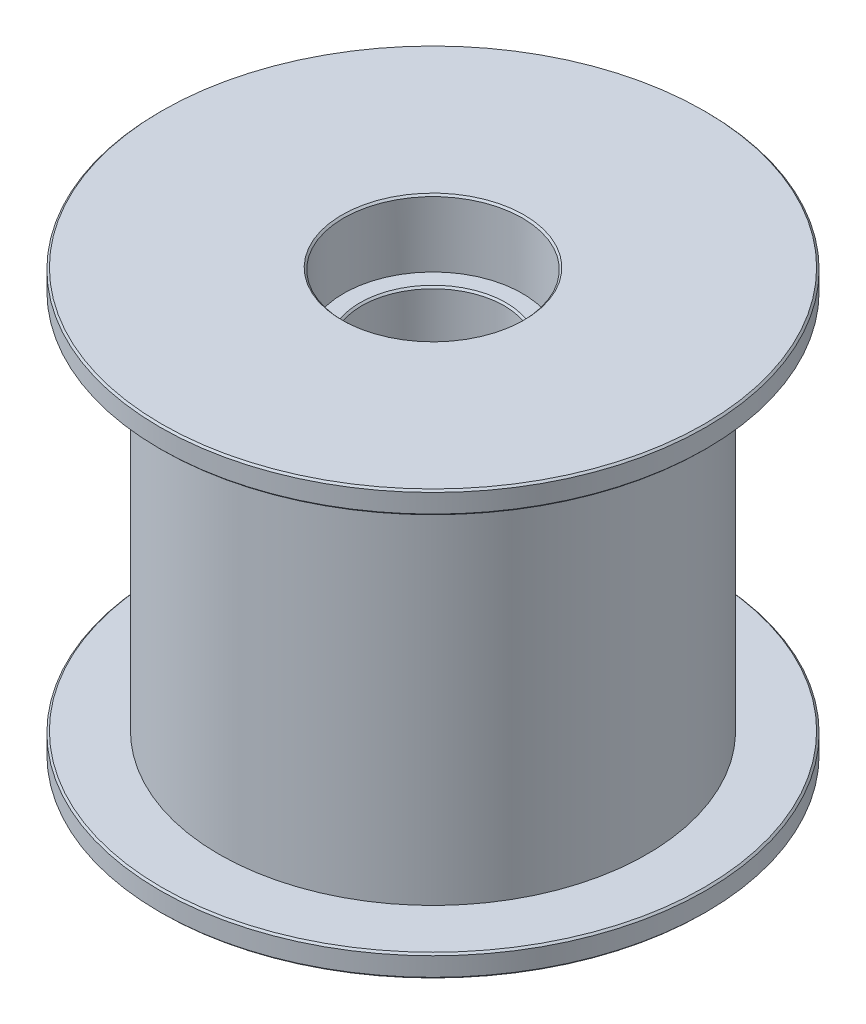
ISO-10303-21;
HEADER;
FILE_DESCRIPTION(('STEP AP214'),'2;1');
FILE_NAME('part.step','',(''),(''),'','','');
FILE_SCHEMA(('AUTOMOTIVE_DESIGN { 1 0 10303 214 1 1 1 1 }'));
ENDSEC;
DATA;
#1=APPLICATION_CONTEXT('core data for automotive mechanical design processes');
#2=APPLICATION_PROTOCOL_DEFINITION('international standard','automotive_design',2000,#1);
#3=PRODUCT_CONTEXT('',#1,'mechanical');
#4=PRODUCT('Part','Part','',(#3));
#5=PRODUCT_RELATED_PRODUCT_CATEGORY('part','',(#4));
#6=PRODUCT_DEFINITION_FORMATION('','',#4);
#7=PRODUCT_DEFINITION_CONTEXT('part definition',#1,'design');
#8=PRODUCT_DEFINITION('design','',#6,#7);
#9=PRODUCT_DEFINITION_SHAPE('','',#8);
#10=(LENGTH_UNIT() NAMED_UNIT(*) SI_UNIT(.MILLI.,.METRE.));
#11=(NAMED_UNIT(*) PLANE_ANGLE_UNIT() SI_UNIT($,.RADIAN.));
#12=(NAMED_UNIT(*) SI_UNIT($,.STERADIAN.) SOLID_ANGLE_UNIT());
#13=UNCERTAINTY_MEASURE_WITH_UNIT(LENGTH_MEASURE(1.E-05),#10,'distance_accuracy_value','');
#14=(GEOMETRIC_REPRESENTATION_CONTEXT(3) GLOBAL_UNCERTAINTY_ASSIGNED_CONTEXT((#13)) GLOBAL_UNIT_ASSIGNED_CONTEXT((#10,
#11,#12)) REPRESENTATION_CONTEXT('',''));
#15=CARTESIAN_POINT('',(0.,0.,0.));
#16=DIRECTION('',(0.,0.,1.));
#17=DIRECTION('',(1.,0.,0.));
#18=AXIS2_PLACEMENT_3D('',#15,#16,#17);
#19=CARTESIAN_POINT('',(0.,30.1625,0.));
#20=DIRECTION('',(0.,1.,0.));
#21=DIRECTION('',(0.,0.,1.));
#22=AXIS2_PLACEMENT_3D('',#19,#20,#21);
#23=CYLINDRICAL_SURFACE('',#22,19.446875);
#24=CARTESIAN_POINT('',(0.,1.4605,0.));
#25=DIRECTION('',(0.,-1.,0.));
#26=DIRECTION('',(0.,0.,-1.));
#27=AXIS2_PLACEMENT_3D('',#24,#25,#26);
#28=CIRCLE('',#27,19.446875);
#29=CARTESIAN_POINT('',(0.,1.4605,-19.446875));
#30=VERTEX_POINT('',#29);
#31=EDGE_CURVE('E94',#30,#30,#28,.T.);
#32=ORIENTED_EDGE('',*,*,#31,.T.);
#33=EDGE_LOOP('',(#32));
#34=FACE_BOUND('',#33,.T.);
#35=CARTESIAN_POINT('',(0.,0.126999999999995,0.));
#36=DIRECTION('',(0.,1.,0.));
#37=DIRECTION('',(0.,0.,1.));
#38=AXIS2_PLACEMENT_3D('',#35,#36,#37);
#39=CIRCLE('',#38,19.446875);
#40=CARTESIAN_POINT('',(0.,0.126999999999995,19.446875));
#41=VERTEX_POINT('',#40);
#42=EDGE_CURVE('E98',#41,#41,#39,.T.);
#43=ORIENTED_EDGE('',*,*,#42,.T.);
#44=EDGE_LOOP('',(#43));
#45=FACE_BOUND('',#44,.T.);
#46=ADVANCED_FACE('F45',(#34,#45),#23,.T.);
#47=CARTESIAN_POINT('',(19.446875,1.5875,0.));
#48=DIRECTION('',(0.,-1.,0.));
#49=DIRECTION('',(0.,0.,-1.));
#50=AXIS2_PLACEMENT_3D('',#47,#48,#49);
#51=PLANE('',#50);
#52=CARTESIAN_POINT('',(0.,1.5875,0.));
#53=DIRECTION('',(0.,-1.,0.));
#54=DIRECTION('',(0.,0.,-1.));
#55=AXIS2_PLACEMENT_3D('',#52,#53,#54);
#56=CIRCLE('',#55,19.319875);
#57=CARTESIAN_POINT('',(0.,1.5875,-19.319875));
#58=VERTEX_POINT('',#57);
#59=EDGE_CURVE('E102',#58,#58,#56,.F.);
#60=ORIENTED_EDGE('',*,*,#59,.T.);
#61=EDGE_LOOP('',(#60));
#62=FACE_BOUND('',#61,.T.);
#63=CARTESIAN_POINT('',(0.,1.5875,0.));
#64=DIRECTION('',(0.,1.,0.));
#65=DIRECTION('',(0.,0.,1.));
#66=AXIS2_PLACEMENT_3D('',#63,#64,#65);
#67=CIRCLE('',#66,15.24);
#68=CARTESIAN_POINT('',(0.,1.5875,15.24));
#69=VERTEX_POINT('',#68);
#70=EDGE_CURVE('E118',#69,#69,#67,.T.);
#71=ORIENTED_EDGE('',*,*,#70,.F.);
#72=EDGE_LOOP('',(#71));
#73=FACE_BOUND('',#72,.T.);
#74=ADVANCED_FACE('F153',(#62,#73),#51,.F.);
#75=CARTESIAN_POINT('',(0.,30.1625,0.));
#76=DIRECTION('',(0.,1.,0.));
#77=DIRECTION('',(0.,0.,1.));
#78=AXIS2_PLACEMENT_3D('',#75,#76,#77);
#79=CYLINDRICAL_SURFACE('',#78,15.24);
#80=CARTESIAN_POINT('',(0.,28.575,0.));
#81=DIRECTION('',(0.,1.,0.));
#82=DIRECTION('',(0.,0.,1.));
#83=AXIS2_PLACEMENT_3D('',#80,#81,#82);
#84=CIRCLE('',#83,15.24);
#85=CARTESIAN_POINT('',(0.,28.575,15.24));
#86=VERTEX_POINT('',#85);
#87=EDGE_CURVE('E122',#86,#86,#84,.T.);
#88=ORIENTED_EDGE('',*,*,#87,.F.);
#89=EDGE_LOOP('',(#88));
#90=FACE_BOUND('',#89,.T.);
#91=ORIENTED_EDGE('',*,*,#70,.T.);
#92=EDGE_LOOP('',(#91));
#93=FACE_BOUND('',#92,.T.);
#94=ADVANCED_FACE('F160',(#90,#93),#79,.T.);
#95=CARTESIAN_POINT('',(15.24,28.575,0.));
#96=DIRECTION('',(0.,1.,0.));
#97=DIRECTION('',(0.,0.,1.));
#98=AXIS2_PLACEMENT_3D('',#95,#96,#97);
#99=PLANE('',#98);
#100=CARTESIAN_POINT('',(0.,28.575,0.));
#101=DIRECTION('',(0.,1.,0.));
#102=DIRECTION('',(0.,0.,1.));
#103=AXIS2_PLACEMENT_3D('',#100,#101,#102);
#104=CIRCLE('',#103,19.319875);
#105=CARTESIAN_POINT('',(0.,28.575,19.319875));
#106=VERTEX_POINT('',#105);
#107=EDGE_CURVE('E106',#106,#106,#104,.F.);
#108=ORIENTED_EDGE('',*,*,#107,.T.);
#109=EDGE_LOOP('',(#108));
#110=FACE_BOUND('',#109,.T.);
#111=ORIENTED_EDGE('',*,*,#87,.T.);
#112=EDGE_LOOP('',(#111));
#113=FACE_BOUND('',#112,.T.);
#114=ADVANCED_FACE('F223',(#110,#113),#99,.F.);
#115=CARTESIAN_POINT('',(0.,30.1625,0.));
#116=DIRECTION('',(0.,1.,0.));
#117=DIRECTION('',(0.,0.,1.));
#118=AXIS2_PLACEMENT_3D('',#115,#116,#117);
#119=CYLINDRICAL_SURFACE('',#118,19.446875);
#120=CARTESIAN_POINT('',(0.,28.702,0.));
#121=DIRECTION('',(0.,1.,0.));
#122=DIRECTION('',(0.,0.,1.));
#123=AXIS2_PLACEMENT_3D('',#120,#121,#122);
#124=CIRCLE('',#123,19.446875);
#125=CARTESIAN_POINT('',(0.,28.702,19.446875));
#126=VERTEX_POINT('',#125);
#127=EDGE_CURVE('E110',#126,#126,#124,.T.);
#128=ORIENTED_EDGE('',*,*,#127,.T.);
#129=EDGE_LOOP('',(#128));
#130=FACE_BOUND('',#129,.T.);
#131=CARTESIAN_POINT('',(0.,30.0355,0.));
#132=DIRECTION('',(0.,-1.,0.));
#133=DIRECTION('',(0.,0.,-1.));
#134=AXIS2_PLACEMENT_3D('',#131,#132,#133);
#135=CIRCLE('',#134,19.446875);
#136=CARTESIAN_POINT('',(0.,30.0355,-19.446875));
#137=VERTEX_POINT('',#136);
#138=EDGE_CURVE('E114',#137,#137,#135,.T.);
#139=ORIENTED_EDGE('',*,*,#138,.T.);
#140=EDGE_LOOP('',(#139));
#141=FACE_BOUND('',#140,.T.);
#142=ADVANCED_FACE('F220',(#130,#141),#119,.T.);
#143=CARTESIAN_POINT('',(19.446875,30.1625,0.));
#144=DIRECTION('',(0.,-1.,0.));
#145=DIRECTION('',(0.,0.,-1.));
#146=AXIS2_PLACEMENT_3D('',#143,#144,#145);
#147=PLANE('',#146);
#148=CARTESIAN_POINT('',(0.,30.1625,0.));
#149=DIRECTION('',(0.,-1.,0.));
#150=DIRECTION('',(0.,0.,-1.));
#151=AXIS2_PLACEMENT_3D('',#148,#149,#150);
#152=CIRCLE('',#151,19.319875);
#153=CARTESIAN_POINT('',(0.,30.1625,-19.319875));
#154=VERTEX_POINT('',#153);
#155=EDGE_CURVE('E54',#154,#154,#152,.F.);
#156=ORIENTED_EDGE('',*,*,#155,.T.);
#157=EDGE_LOOP('',(#156));
#158=FACE_BOUND('',#157,.T.);
#159=CARTESIAN_POINT('',(0.,30.1625,0.));
#160=DIRECTION('',(0.,-1.,0.));
#161=DIRECTION('',(0.,0.,-1.));
#162=AXIS2_PLACEMENT_3D('',#159,#160,#161);
#163=CIRCLE('',#162,6.4897);
#164=CARTESIAN_POINT('',(0.,30.1625,-6.4897));
#165=VERTEX_POINT('',#164);
#166=EDGE_CURVE('E59',#165,#165,#163,.T.);
#167=ORIENTED_EDGE('',*,*,#166,.T.);
#168=EDGE_LOOP('',(#167));
#169=FACE_BOUND('',#168,.T.);
#170=ADVANCED_FACE('F222',(#158,#169),#147,.F.);
#171=CARTESIAN_POINT('',(0.,30.1625,0.));
#172=DIRECTION('',(0.,1.,0.));
#173=DIRECTION('',(0.,0.,1.));
#174=AXIS2_PLACEMENT_3D('',#171,#172,#173);
#175=CYLINDRICAL_SURFACE('',#174,6.3627);
#176=CARTESIAN_POINT('',(0.,30.0355,0.));
#177=DIRECTION('',(0.,-1.,0.));
#178=DIRECTION('',(0.,0.,-1.));
#179=AXIS2_PLACEMENT_3D('',#176,#177,#178);
#180=CIRCLE('',#179,6.3627);
#181=CARTESIAN_POINT('',(0.,30.0355,-6.3627));
#182=VERTEX_POINT('',#181);
#183=EDGE_CURVE('E10',#182,#182,#180,.F.);
#184=ORIENTED_EDGE('',*,*,#183,.T.);
#185=EDGE_LOOP('',(#184));
#186=FACE_BOUND('',#185,.T.);
#187=CARTESIAN_POINT('',(0.,25.3873,0.));
#188=DIRECTION('',(0.,1.,0.));
#189=DIRECTION('',(0.,0.,1.));
#190=AXIS2_PLACEMENT_3D('',#187,#188,#189);
#191=CIRCLE('',#190,6.3627);
#192=CARTESIAN_POINT('',(0.,25.3873,6.3627));
#193=VERTEX_POINT('',#192);
#194=EDGE_CURVE('E126',#193,#193,#191,.T.);
#195=ORIENTED_EDGE('',*,*,#194,.F.);
#196=EDGE_LOOP('',(#195));
#197=FACE_BOUND('',#196,.T.);
#198=ADVANCED_FACE('F230',(#186,#197),#175,.F.);
#199=CARTESIAN_POINT('',(5.08,25.3873,0.));
#200=DIRECTION('',(0.,-1.,0.));
#201=DIRECTION('',(0.,0.,-1.));
#202=AXIS2_PLACEMENT_3D('',#199,#200,#201);
#203=PLANE('',#202);
#204=CARTESIAN_POINT('',(0.,25.3873,0.));
#205=DIRECTION('',(0.,-1.,0.));
#206=DIRECTION('',(0.,0.,-1.));
#207=AXIS2_PLACEMENT_3D('',#204,#205,#206);
#208=CIRCLE('',#207,5.20700000000001);
#209=CARTESIAN_POINT('',(0.,25.3873,-5.20700000000001));
#210=VERTEX_POINT('',#209);
#211=EDGE_CURVE('E70',#210,#210,#208,.T.);
#212=ORIENTED_EDGE('',*,*,#211,.T.);
#213=EDGE_LOOP('',(#212));
#214=FACE_BOUND('',#213,.T.);
#215=ORIENTED_EDGE('',*,*,#194,.T.);
#216=EDGE_LOOP('',(#215));
#217=FACE_BOUND('',#216,.T.);
#218=ADVANCED_FACE('F149',(#214,#217),#203,.F.);
#219=CARTESIAN_POINT('',(0.,30.1625,0.));
#220=DIRECTION('',(0.,1.,0.));
#221=DIRECTION('',(0.,0.,1.));
#222=AXIS2_PLACEMENT_3D('',#219,#220,#221);
#223=CYLINDRICAL_SURFACE('',#222,5.08);
#224=CARTESIAN_POINT('',(0.,25.2603,0.));
#225=DIRECTION('',(0.,-1.,0.));
#226=DIRECTION('',(0.,0.,-1.));
#227=AXIS2_PLACEMENT_3D('',#224,#225,#226);
#228=CIRCLE('',#227,5.08);
#229=CARTESIAN_POINT('',(0.,25.2603,-5.08));
#230=VERTEX_POINT('',#229);
#231=EDGE_CURVE('E74',#230,#230,#228,.F.);
#232=ORIENTED_EDGE('',*,*,#231,.T.);
#233=EDGE_LOOP('',(#232));
#234=FACE_BOUND('',#233,.T.);
#235=CARTESIAN_POINT('',(0.,4.9022,0.));
#236=DIRECTION('',(0.,1.,0.));
#237=DIRECTION('',(0.,0.,1.));
#238=AXIS2_PLACEMENT_3D('',#235,#236,#237);
#239=CIRCLE('',#238,5.08);
#240=CARTESIAN_POINT('',(0.,4.9022,5.08));
#241=VERTEX_POINT('',#240);
#242=EDGE_CURVE('E78',#241,#241,#239,.F.);
#243=ORIENTED_EDGE('',*,*,#242,.T.);
#244=EDGE_LOOP('',(#243));
#245=FACE_BOUND('',#244,.T.);
#246=ADVANCED_FACE('F139',(#234,#245),#223,.F.);
#247=CARTESIAN_POINT('',(6.3627,4.7752,0.));
#248=DIRECTION('',(0.,1.,0.));
#249=DIRECTION('',(0.,0.,1.));
#250=AXIS2_PLACEMENT_3D('',#247,#248,#249);
#251=PLANE('',#250);
#252=CARTESIAN_POINT('',(0.,4.7752,0.));
#253=DIRECTION('',(0.,1.,0.));
#254=DIRECTION('',(0.,0.,1.));
#255=AXIS2_PLACEMENT_3D('',#252,#253,#254);
#256=CIRCLE('',#255,5.207);
#257=CARTESIAN_POINT('',(0.,4.7752,5.207));
#258=VERTEX_POINT('',#257);
#259=EDGE_CURVE('E64',#258,#258,#256,.T.);
#260=ORIENTED_EDGE('',*,*,#259,.T.);
#261=EDGE_LOOP('',(#260));
#262=FACE_BOUND('',#261,.T.);
#263=CARTESIAN_POINT('',(0.,4.7752,0.));
#264=DIRECTION('',(0.,1.,0.));
#265=DIRECTION('',(0.,0.,1.));
#266=AXIS2_PLACEMENT_3D('',#263,#264,#265);
#267=CIRCLE('',#266,6.3627);
#268=CARTESIAN_POINT('',(0.,4.7752,6.3627));
#269=VERTEX_POINT('',#268);
#270=EDGE_CURVE('E130',#269,#269,#267,.T.);
#271=ORIENTED_EDGE('',*,*,#270,.F.);
#272=EDGE_LOOP('',(#271));
#273=FACE_BOUND('',#272,.T.);
#274=ADVANCED_FACE('F137',(#262,#273),#251,.F.);
#275=CARTESIAN_POINT('',(0.,30.1625,0.));
#276=DIRECTION('',(0.,1.,0.));
#277=DIRECTION('',(0.,0.,1.));
#278=AXIS2_PLACEMENT_3D('',#275,#276,#277);
#279=CYLINDRICAL_SURFACE('',#278,6.3627);
#280=CARTESIAN_POINT('',(0.,0.127000000000006,0.));
#281=DIRECTION('',(0.,1.,0.));
#282=DIRECTION('',(0.,0.,1.));
#283=AXIS2_PLACEMENT_3D('',#280,#281,#282);
#284=CIRCLE('',#283,6.3627);
#285=CARTESIAN_POINT('',(0.,0.127000000000006,6.3627));
#286=VERTEX_POINT('',#285);
#287=EDGE_CURVE('E82',#286,#286,#284,.F.);
#288=ORIENTED_EDGE('',*,*,#287,.T.);
#289=EDGE_LOOP('',(#288));
#290=FACE_BOUND('',#289,.T.);
#291=ORIENTED_EDGE('',*,*,#270,.T.);
#292=EDGE_LOOP('',(#291));
#293=FACE_BOUND('',#292,.T.);
#294=ADVANCED_FACE('F135',(#290,#293),#279,.F.);
#295=CARTESIAN_POINT('',(6.3627,0.,0.));
#296=DIRECTION('',(0.,1.,0.));
#297=DIRECTION('',(0.,0.,1.));
#298=AXIS2_PLACEMENT_3D('',#295,#296,#297);
#299=PLANE('',#298);
#300=CARTESIAN_POINT('',(0.,0.,0.));
#301=DIRECTION('',(0.,1.,0.));
#302=DIRECTION('',(0.,0.,1.));
#303=AXIS2_PLACEMENT_3D('',#300,#301,#302);
#304=CIRCLE('',#303,6.4897);
#305=CARTESIAN_POINT('',(0.,0.,6.4897));
#306=VERTEX_POINT('',#305);
#307=EDGE_CURVE('E86',#306,#306,#304,.T.);
#308=ORIENTED_EDGE('',*,*,#307,.T.);
#309=EDGE_LOOP('',(#308));
#310=FACE_BOUND('',#309,.T.);
#311=CARTESIAN_POINT('',(0.,0.,0.));
#312=DIRECTION('',(0.,1.,0.));
#313=DIRECTION('',(0.,0.,1.));
#314=AXIS2_PLACEMENT_3D('',#311,#312,#313);
#315=CIRCLE('',#314,19.319875);
#316=CARTESIAN_POINT('',(0.,0.,19.319875));
#317=VERTEX_POINT('',#316);
#318=EDGE_CURVE('E90',#317,#317,#315,.F.);
#319=ORIENTED_EDGE('',*,*,#318,.T.);
#320=EDGE_LOOP('',(#319));
#321=FACE_BOUND('',#320,.T.);
#322=ADVANCED_FACE('F146',(#310,#321),#299,.F.);
#323=CARTESIAN_POINT('',(0.,28.702,0.));
#324=DIRECTION('',(0.,1.,0.));
#325=DIRECTION('',(0.,0.,1.));
#326=AXIS2_PLACEMENT_3D('',#323,#324,#325);
#327=CONICAL_SURFACE('',#326,19.446875,0.785398163397448);
#328=ORIENTED_EDGE('',*,*,#107,.F.);
#329=EDGE_LOOP('',(#328));
#330=FACE_BOUND('',#329,.T.);
#331=ORIENTED_EDGE('',*,*,#127,.F.);
#332=EDGE_LOOP('',(#331));
#333=FACE_BOUND('',#332,.T.);
#334=ADVANCED_FACE('F167',(#330,#333),#327,.T.);
#335=CARTESIAN_POINT('',(0.,1.5875,0.));
#336=DIRECTION('',(0.,-1.,0.));
#337=DIRECTION('',(0.,0.,-1.));
#338=AXIS2_PLACEMENT_3D('',#335,#336,#337);
#339=CONICAL_SURFACE('',#338,19.319875,0.785398163397448);
#340=ORIENTED_EDGE('',*,*,#31,.F.);
#341=EDGE_LOOP('',(#340));
#342=FACE_BOUND('',#341,.T.);
#343=ORIENTED_EDGE('',*,*,#59,.F.);
#344=EDGE_LOOP('',(#343));
#345=FACE_BOUND('',#344,.T.);
#346=ADVANCED_FACE('F173',(#342,#345),#339,.T.);
#347=CARTESIAN_POINT('',(0.,0.,0.));
#348=DIRECTION('',(0.,-1.,0.));
#349=DIRECTION('',(0.,0.,-1.));
#350=AXIS2_PLACEMENT_3D('',#347,#348,#349);
#351=CONICAL_SURFACE('',#350,6.4897,0.785398163397424);
#352=ORIENTED_EDGE('',*,*,#287,.F.);
#353=EDGE_LOOP('',(#352));
#354=FACE_BOUND('',#353,.T.);
#355=ORIENTED_EDGE('',*,*,#307,.F.);
#356=EDGE_LOOP('',(#355));
#357=FACE_BOUND('',#356,.T.);
#358=ADVANCED_FACE('F180',(#354,#357),#351,.F.);
#359=CARTESIAN_POINT('',(0.,0.126999999999995,0.));
#360=DIRECTION('',(0.,1.,0.));
#361=DIRECTION('',(0.,0.,1.));
#362=AXIS2_PLACEMENT_3D('',#359,#360,#361);
#363=CONICAL_SURFACE('',#362,19.446875,0.785398163397462);
#364=ORIENTED_EDGE('',*,*,#318,.F.);
#365=EDGE_LOOP('',(#364));
#366=FACE_BOUND('',#365,.T.);
#367=ORIENTED_EDGE('',*,*,#42,.F.);
#368=EDGE_LOOP('',(#367));
#369=FACE_BOUND('',#368,.T.);
#370=ADVANCED_FACE('F187',(#366,#369),#363,.T.);
#371=CARTESIAN_POINT('',(0.,25.2603,0.));
#372=DIRECTION('',(0.,1.,0.));
#373=DIRECTION('',(0.,0.,1.));
#374=AXIS2_PLACEMENT_3D('',#371,#372,#373);
#375=CONICAL_SURFACE('',#374,5.08,0.785398163397442);
#376=ORIENTED_EDGE('',*,*,#211,.F.);
#377=EDGE_LOOP('',(#376));
#378=FACE_BOUND('',#377,.T.);
#379=ORIENTED_EDGE('',*,*,#231,.F.);
#380=EDGE_LOOP('',(#379));
#381=FACE_BOUND('',#380,.T.);
#382=ADVANCED_FACE('F194',(#378,#381),#375,.F.);
#383=CARTESIAN_POINT('',(0.,4.7752,0.));
#384=DIRECTION('',(0.,-1.,0.));
#385=DIRECTION('',(0.,0.,-1.));
#386=AXIS2_PLACEMENT_3D('',#383,#384,#385);
#387=CONICAL_SURFACE('',#386,5.207,0.785398163397428);
#388=ORIENTED_EDGE('',*,*,#242,.F.);
#389=EDGE_LOOP('',(#388));
#390=FACE_BOUND('',#389,.T.);
#391=ORIENTED_EDGE('',*,*,#259,.F.);
#392=EDGE_LOOP('',(#391));
#393=FACE_BOUND('',#392,.T.);
#394=ADVANCED_FACE('F201',(#390,#393),#387,.F.);
#395=CARTESIAN_POINT('',(0.,30.1625,0.));
#396=DIRECTION('',(0.,-1.,0.));
#397=DIRECTION('',(0.,0.,-1.));
#398=AXIS2_PLACEMENT_3D('',#395,#396,#397);
#399=CONICAL_SURFACE('',#398,19.319875,0.785398163397448);
#400=ORIENTED_EDGE('',*,*,#138,.F.);
#401=EDGE_LOOP('',(#400));
#402=FACE_BOUND('',#401,.T.);
#403=ORIENTED_EDGE('',*,*,#155,.F.);
#404=EDGE_LOOP('',(#403));
#405=FACE_BOUND('',#404,.T.);
#406=ADVANCED_FACE('F207',(#402,#405),#399,.T.);
#407=CARTESIAN_POINT('',(0.,30.0355,0.));
#408=DIRECTION('',(0.,1.,0.));
#409=DIRECTION('',(0.,0.,1.));
#410=AXIS2_PLACEMENT_3D('',#407,#408,#409);
#411=CONICAL_SURFACE('',#410,6.3627,0.785398163397455);
#412=ORIENTED_EDGE('',*,*,#166,.F.);
#413=EDGE_LOOP('',(#412));
#414=FACE_BOUND('',#413,.T.);
#415=ORIENTED_EDGE('',*,*,#183,.F.);
#416=EDGE_LOOP('',(#415));
#417=FACE_BOUND('',#416,.T.);
#418=ADVANCED_FACE('F48',(#414,#417),#411,.F.);
#419=CLOSED_SHELL('',(#46,#74,#94,#114,#142,#170,#198,#218,#246,#274,#294,#322,#334,#346,#358,
#370,#382,#394,#406,#418));
#420=MANIFOLD_SOLID_BREP('B2',#419);
#421=ADVANCED_BREP_SHAPE_REPRESENTATION('',(#18,#420),#14);
#422=SHAPE_DEFINITION_REPRESENTATION(#9,#421);
ENDSEC;
END-ISO-10303-21;
